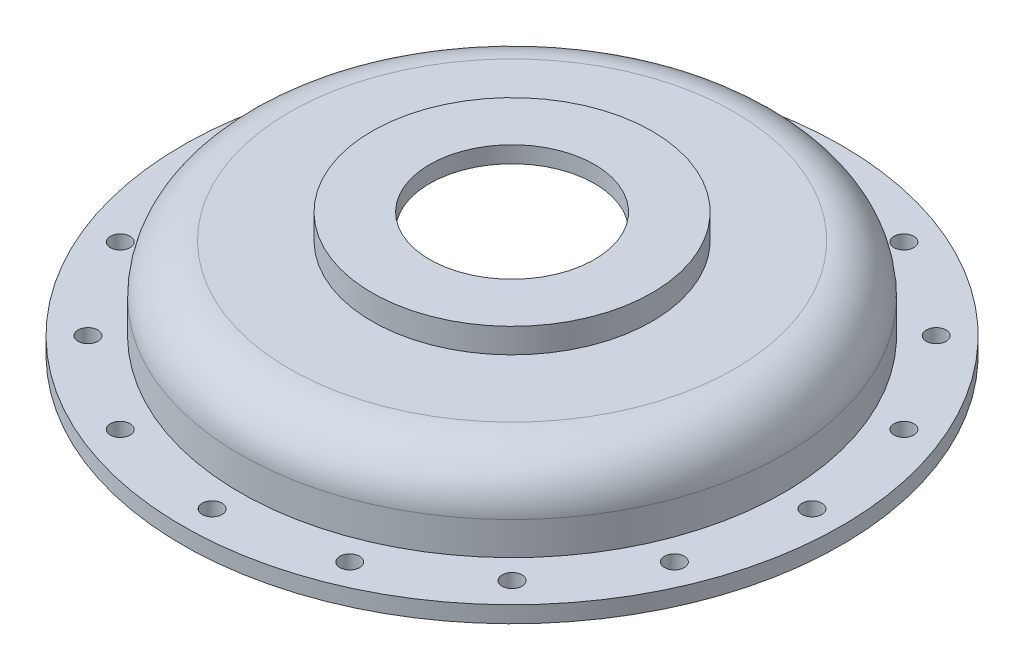
ISO-10303-21;
HEADER;
FILE_DESCRIPTION(('STEP AP214'),'2;1');
FILE_NAME('part.step','',(''),(''),'','','');
FILE_SCHEMA(('AUTOMOTIVE_DESIGN { 1 0 10303 214 1 1 1 1 }'));
ENDSEC;
DATA;
#1=APPLICATION_CONTEXT('core data for automotive mechanical design processes');
#2=APPLICATION_PROTOCOL_DEFINITION('international standard','automotive_design',2000,#1);
#3=PRODUCT_CONTEXT('',#1,'mechanical');
#4=PRODUCT('Part','Part','',(#3));
#5=PRODUCT_RELATED_PRODUCT_CATEGORY('part','',(#4));
#6=PRODUCT_DEFINITION_FORMATION('','',#4);
#7=PRODUCT_DEFINITION_CONTEXT('part definition',#1,'design');
#8=PRODUCT_DEFINITION('design','',#6,#7);
#9=PRODUCT_DEFINITION_SHAPE('','',#8);
#10=(LENGTH_UNIT() NAMED_UNIT(*) SI_UNIT(.MILLI.,.METRE.));
#11=(NAMED_UNIT(*) PLANE_ANGLE_UNIT() SI_UNIT($,.RADIAN.));
#12=(NAMED_UNIT(*) SI_UNIT($,.STERADIAN.) SOLID_ANGLE_UNIT());
#13=UNCERTAINTY_MEASURE_WITH_UNIT(LENGTH_MEASURE(1.E-05),#10,'distance_accuracy_value','');
#14=(GEOMETRIC_REPRESENTATION_CONTEXT(3) GLOBAL_UNCERTAINTY_ASSIGNED_CONTEXT((#13)) GLOBAL_UNIT_ASSIGNED_CONTEXT((#10,
#11,#12)) REPRESENTATION_CONTEXT('',''));
#15=CARTESIAN_POINT('',(0.,0.,0.));
#16=DIRECTION('',(0.,0.,1.));
#17=DIRECTION('',(1.,0.,0.));
#18=AXIS2_PLACEMENT_3D('',#15,#16,#17);
#19=CARTESIAN_POINT('',(0.,0.,0.));
#20=DIRECTION('',(0.,-1.,0.));
#21=DIRECTION('',(0.,0.,-1.));
#22=AXIS2_PLACEMENT_3D('',#19,#20,#21);
#23=CYLINDRICAL_SURFACE('',#22,200.);
#24=CARTESIAN_POINT('',(0.,0.,0.));
#25=DIRECTION('',(0.,-1.,0.));
#26=DIRECTION('',(0.,0.,-1.));
#27=AXIS2_PLACEMENT_3D('',#24,#25,#26);
#28=CIRCLE('',#27,200.);
#29=CARTESIAN_POINT('',(0.,0.,-200.));
#30=VERTEX_POINT('',#29);
#31=EDGE_CURVE('E100',#30,#30,#28,.T.);
#32=ORIENTED_EDGE('',*,*,#31,.F.);
#33=EDGE_LOOP('',(#32));
#34=FACE_BOUND('',#33,.T.);
#35=CARTESIAN_POINT('',(0.,10.,0.));
#36=DIRECTION('',(0.,-1.,0.));
#37=DIRECTION('',(0.,0.,-1.));
#38=AXIS2_PLACEMENT_3D('',#35,#36,#37);
#39=CIRCLE('',#38,200.);
#40=CARTESIAN_POINT('',(0.,10.,-200.));
#41=VERTEX_POINT('',#40);
#42=EDGE_CURVE('E10',#41,#41,#39,.T.);
#43=ORIENTED_EDGE('',*,*,#42,.T.);
#44=EDGE_LOOP('',(#43));
#45=FACE_BOUND('',#44,.T.);
#46=ADVANCED_FACE('F41',(#34,#45),#23,.T.);
#47=CARTESIAN_POINT('',(-200.,10.,0.));
#48=DIRECTION('',(0.,-1.,0.));
#49=DIRECTION('',(0.,0.,-1.));
#50=AXIS2_PLACEMENT_3D('',#47,#48,#49);
#51=PLANE('',#50);
#52=CARTESIAN_POINT('',(128.693434175952,10.,-128.693434175951));
#53=DIRECTION('',(0.,1.,0.));
#54=DIRECTION('',(-0.707106781186549,0.,0.707106781186546));
#55=AXIS2_PLACEMENT_3D('',#52,#53,#54);
#56=CIRCLE('',#55,6.);
#57=CARTESIAN_POINT('',(124.450793488833,10.,-124.450793488832));
#58=VERTEX_POINT('',#57);
#59=EDGE_CURVE('E178',#58,#58,#56,.T.);
#60=ORIENTED_EDGE('',*,*,#59,.F.);
#61=EDGE_LOOP('',(#60));
#62=FACE_BOUND('',#61,.T.);
#63=CARTESIAN_POINT('',(168.146074917054,10.,-69.6483846904459));
#64=DIRECTION('',(0.,1.,0.));
#65=DIRECTION('',(-0.923879532511288,0.,0.382683432365087));
#66=AXIS2_PLACEMENT_3D('',#63,#64,#65);
#67=CIRCLE('',#66,6.);
#68=CARTESIAN_POINT('',(162.602797721987,10.,-67.3522840962554));
#69=VERTEX_POINT('',#68);
#70=EDGE_CURVE('E170',#69,#69,#67,.T.);
#71=ORIENTED_EDGE('',*,*,#70,.F.);
#72=EDGE_LOOP('',(#71));
#73=FACE_BOUND('',#72,.T.);
#74=CARTESIAN_POINT('',(182.,10.,6.3544960366945E-13));
#75=DIRECTION('',(0.,1.,0.));
#76=DIRECTION('',(-1.,0.,0.));
#77=AXIS2_PLACEMENT_3D('',#74,#75,#76);
#78=CIRCLE('',#77,6.);
#79=CARTESIAN_POINT('',(176.,10.,6.14500715636391E-13));
#80=VERTEX_POINT('',#79);
#81=EDGE_CURVE('E162',#80,#80,#78,.T.);
#82=ORIENTED_EDGE('',*,*,#81,.F.);
#83=EDGE_LOOP('',(#82));
#84=FACE_BOUND('',#83,.T.);
#85=CARTESIAN_POINT('',(168.146074917054,10.,69.6483846904471));
#86=DIRECTION('',(0.,1.,0.));
#87=DIRECTION('',(-0.923879532511285,0.,-0.382683432365094));
#88=AXIS2_PLACEMENT_3D('',#85,#86,#87);
#89=CIRCLE('',#88,6.);
#90=CARTESIAN_POINT('',(162.602797721986,10.,67.3522840962565));
#91=VERTEX_POINT('',#90);
#92=EDGE_CURVE('E154',#91,#91,#89,.T.);
#93=ORIENTED_EDGE('',*,*,#92,.F.);
#94=EDGE_LOOP('',(#93));
#95=FACE_BOUND('',#94,.T.);
#96=CARTESIAN_POINT('',(128.693434175951,10.,128.693434175952));
#97=DIRECTION('',(0.,1.,0.));
#98=DIRECTION('',(-0.707106781186544,0.,-0.707106781186551));
#99=AXIS2_PLACEMENT_3D('',#96,#97,#98);
#100=CIRCLE('',#99,6.);
#101=CARTESIAN_POINT('',(124.450793488832,10.,124.450793488833));
#102=VERTEX_POINT('',#101);
#103=EDGE_CURVE('E146',#102,#102,#100,.T.);
#104=ORIENTED_EDGE('',*,*,#103,.F.);
#105=EDGE_LOOP('',(#104));
#106=FACE_BOUND('',#105,.T.);
#107=CARTESIAN_POINT('',(69.6483846904453,10.,168.146074917055));
#108=DIRECTION('',(0.,1.,0.));
#109=DIRECTION('',(-0.382683432365084,0.,-0.923879532511289));
#110=AXIS2_PLACEMENT_3D('',#107,#108,#109);
#111=CIRCLE('',#110,6.);
#112=CARTESIAN_POINT('',(67.3522840962548,10.,162.602797721987));
#113=VERTEX_POINT('',#112);
#114=EDGE_CURVE('E138',#113,#113,#111,.T.);
#115=ORIENTED_EDGE('',*,*,#114,.F.);
#116=EDGE_LOOP('',(#115));
#117=FACE_BOUND('',#116,.T.);
#118=CARTESIAN_POINT('',(0.,10.,182.));
#119=DIRECTION('',(0.,1.,0.));
#120=DIRECTION('',(0.,0.,-1.));
#121=AXIS2_PLACEMENT_3D('',#118,#119,#120);
#122=CIRCLE('',#121,6.);
#123=CARTESIAN_POINT('',(0.,10.,176.));
#124=VERTEX_POINT('',#123);
#125=EDGE_CURVE('E130',#124,#124,#122,.T.);
#126=ORIENTED_EDGE('',*,*,#125,.F.);
#127=EDGE_LOOP('',(#126));
#128=FACE_BOUND('',#127,.T.);
#129=CARTESIAN_POINT('',(-69.6483846904477,10.,168.146074917054));
#130=DIRECTION('',(0.,1.,0.));
#131=DIRECTION('',(0.382683432365097,0.,-0.923879532511284));
#132=AXIS2_PLACEMENT_3D('',#129,#130,#131);
#133=CIRCLE('',#132,6.);
#134=CARTESIAN_POINT('',(-67.3522840962571,10.,162.602797721986));
#135=VERTEX_POINT('',#134);
#136=EDGE_CURVE('E121',#135,#135,#133,.T.);
#137=ORIENTED_EDGE('',*,*,#136,.F.);
#138=EDGE_LOOP('',(#137));
#139=FACE_BOUND('',#138,.T.);
#140=CARTESIAN_POINT('',(-128.693434175953,10.,128.693434175951));
#141=DIRECTION('',(0.,1.,0.));
#142=DIRECTION('',(0.707106781186554,0.,-0.707106781186541));
#143=AXIS2_PLACEMENT_3D('',#140,#141,#142);
#144=CIRCLE('',#143,6.);
#145=CARTESIAN_POINT('',(-124.450793488833,10.,124.450793488831));
#146=VERTEX_POINT('',#145);
#147=EDGE_CURVE('E225',#146,#146,#144,.T.);
#148=ORIENTED_EDGE('',*,*,#147,.F.);
#149=EDGE_LOOP('',(#148));
#150=FACE_BOUND('',#149,.T.);
#151=CARTESIAN_POINT('',(-168.146074917055,10.,69.6483846904447));
#152=DIRECTION('',(0.,1.,0.));
#153=DIRECTION('',(0.923879532511291,0.,-0.382683432365081));
#154=AXIS2_PLACEMENT_3D('',#151,#152,#153);
#155=CIRCLE('',#154,6.);
#156=CARTESIAN_POINT('',(-162.602797721987,10.,67.3522840962542));
#157=VERTEX_POINT('',#156);
#158=EDGE_CURVE('E217',#157,#157,#155,.T.);
#159=ORIENTED_EDGE('',*,*,#158,.F.);
#160=EDGE_LOOP('',(#159));
#161=FACE_BOUND('',#160,.T.);
#162=CARTESIAN_POINT('',(-182.,10.,-1.90634881100835E-12));
#163=DIRECTION('',(0.,1.,0.));
#164=DIRECTION('',(1.,0.,0.));
#165=AXIS2_PLACEMENT_3D('',#162,#163,#164);
#166=CIRCLE('',#165,6.);
#167=CARTESIAN_POINT('',(-176.,10.,-1.84350214690917E-12));
#168=VERTEX_POINT('',#167);
#169=EDGE_CURVE('E209',#168,#168,#166,.T.);
#170=ORIENTED_EDGE('',*,*,#169,.F.);
#171=EDGE_LOOP('',(#170));
#172=FACE_BOUND('',#171,.T.);
#173=CARTESIAN_POINT('',(-168.146074917053,10.,-69.6483846904482));
#174=DIRECTION('',(0.,1.,0.));
#175=DIRECTION('',(0.923879532511283,0.,0.3826834323651));
#176=AXIS2_PLACEMENT_3D('',#173,#174,#175);
#177=CIRCLE('',#176,6.);
#178=CARTESIAN_POINT('',(-162.602797721986,10.,-67.3522840962576));
#179=VERTEX_POINT('',#178);
#180=EDGE_CURVE('E201',#179,#179,#177,.T.);
#181=ORIENTED_EDGE('',*,*,#180,.F.);
#182=EDGE_LOOP('',(#181));
#183=FACE_BOUND('',#182,.T.);
#184=CARTESIAN_POINT('',(-128.69343417595,10.,-128.693434175953));
#185=DIRECTION('',(0.,1.,0.));
#186=DIRECTION('',(0.707106781186539,0.,0.707106781186556));
#187=AXIS2_PLACEMENT_3D('',#184,#185,#186);
#188=CIRCLE('',#187,6.);
#189=CARTESIAN_POINT('',(-124.450793488831,10.,-124.450793488834));
#190=VERTEX_POINT('',#189);
#191=EDGE_CURVE('E193',#190,#190,#188,.T.);
#192=ORIENTED_EDGE('',*,*,#191,.F.);
#193=EDGE_LOOP('',(#192));
#194=FACE_BOUND('',#193,.T.);
#195=CARTESIAN_POINT('',(-69.6483846904441,10.,-168.146074917055));
#196=DIRECTION('',(0.,1.,0.));
#197=DIRECTION('',(0.382683432365077,0.,0.923879532511292));
#198=AXIS2_PLACEMENT_3D('',#195,#196,#197);
#199=CIRCLE('',#198,6.);
#200=CARTESIAN_POINT('',(-67.3522840962536,10.,-162.602797721987));
#201=VERTEX_POINT('',#200);
#202=EDGE_CURVE('E185',#201,#201,#199,.T.);
#203=ORIENTED_EDGE('',*,*,#202,.F.);
#204=EDGE_LOOP('',(#203));
#205=FACE_BOUND('',#204,.T.);
#206=CARTESIAN_POINT('',(69.6483846904465,10.,-168.146074917054));
#207=DIRECTION('',(0.,1.,0.));
#208=DIRECTION('',(-0.382683432365091,0.,0.923879532511287));
#209=AXIS2_PLACEMENT_3D('',#206,#207,#208);
#210=CIRCLE('',#209,6.);
#211=CARTESIAN_POINT('',(67.352284096256,10.,-162.602797721986));
#212=VERTEX_POINT('',#211);
#213=EDGE_CURVE('E113',#212,#212,#210,.T.);
#214=ORIENTED_EDGE('',*,*,#213,.F.);
#215=EDGE_LOOP('',(#214));
#216=FACE_BOUND('',#215,.T.);
#217=CARTESIAN_POINT('',(0.,10.,-182.));
#218=DIRECTION('',(0.,1.,0.));
#219=DIRECTION('',(0.,0.,1.));
#220=AXIS2_PLACEMENT_3D('',#217,#218,#219);
#221=CIRCLE('',#220,6.);
#222=CARTESIAN_POINT('',(0.,10.,-176.));
#223=VERTEX_POINT('',#222);
#224=EDGE_CURVE('E105',#223,#223,#221,.T.);
#225=ORIENTED_EDGE('',*,*,#224,.F.);
#226=EDGE_LOOP('',(#225));
#227=FACE_BOUND('',#226,.T.);
#228=ORIENTED_EDGE('',*,*,#42,.F.);
#229=EDGE_LOOP('',(#228));
#230=FACE_BOUND('',#229,.T.);
#231=CARTESIAN_POINT('',(0.,10.,0.));
#232=DIRECTION('',(0.,-1.,0.));
#233=DIRECTION('',(0.,0.,-1.));
#234=AXIS2_PLACEMENT_3D('',#231,#232,#233);
#235=CIRCLE('',#234,165.);
#236=CARTESIAN_POINT('',(0.,10.,-165.));
#237=VERTEX_POINT('',#236);
#238=EDGE_CURVE('E48',#237,#237,#235,.T.);
#239=ORIENTED_EDGE('',*,*,#238,.T.);
#240=EDGE_LOOP('',(#239));
#241=FACE_BOUND('',#240,.T.);
#242=ADVANCED_FACE('F244',(#62,#73,#84,#95,#106,#117,#128,#139,#150,#161,#172,#183,#194,#205,
#216,#227,#230,#241),#51,.F.);
#243=CARTESIAN_POINT('',(0.,0.,0.));
#244=DIRECTION('',(0.,-1.,0.));
#245=DIRECTION('',(0.,0.,-1.));
#246=AXIS2_PLACEMENT_3D('',#243,#244,#245);
#247=CYLINDRICAL_SURFACE('',#246,165.);
#248=ORIENTED_EDGE('',*,*,#238,.F.);
#249=EDGE_LOOP('',(#248));
#250=FACE_BOUND('',#249,.T.);
#251=CARTESIAN_POINT('',(0.,30.,0.));
#252=DIRECTION('',(0.,-1.,0.));
#253=DIRECTION('',(0.,0.,-1.));
#254=AXIS2_PLACEMENT_3D('',#251,#252,#253);
#255=CIRCLE('',#254,165.);
#256=CARTESIAN_POINT('',(0.,30.,-165.));
#257=VERTEX_POINT('',#256);
#258=EDGE_CURVE('E53',#257,#257,#255,.T.);
#259=ORIENTED_EDGE('',*,*,#258,.T.);
#260=EDGE_LOOP('',(#259));
#261=FACE_BOUND('',#260,.T.);
#262=ADVANCED_FACE('F247',(#250,#261),#247,.T.);
#263=CARTESIAN_POINT('',(0.,30.,0.));
#264=DIRECTION('',(0.,-1.,0.));
#265=DIRECTION('',(0.,0.,-1.));
#266=AXIS2_PLACEMENT_3D('',#263,#264,#265);
#267=TOROIDAL_SURFACE('',#266,135.,30.);
#268=ORIENTED_EDGE('',*,*,#258,.F.);
#269=EDGE_LOOP('',(#268));
#270=FACE_BOUND('',#269,.T.);
#271=CARTESIAN_POINT('',(0.,60.,0.));
#272=DIRECTION('',(0.,-1.,0.));
#273=DIRECTION('',(0.,0.,-1.));
#274=AXIS2_PLACEMENT_3D('',#271,#272,#273);
#275=CIRCLE('',#274,135.);
#276=CARTESIAN_POINT('',(0.,60.,-135.));
#277=VERTEX_POINT('',#276);
#278=EDGE_CURVE('E58',#277,#277,#275,.T.);
#279=ORIENTED_EDGE('',*,*,#278,.T.);
#280=EDGE_LOOP('',(#279));
#281=FACE_BOUND('',#280,.T.);
#282=ADVANCED_FACE('F297',(#270,#281),#267,.T.);
#283=CARTESIAN_POINT('',(-135.,60.,0.));
#284=DIRECTION('',(0.,-1.,0.));
#285=DIRECTION('',(0.,0.,-1.));
#286=AXIS2_PLACEMENT_3D('',#283,#284,#285);
#287=PLANE('',#286);
#288=ORIENTED_EDGE('',*,*,#278,.F.);
#289=EDGE_LOOP('',(#288));
#290=FACE_BOUND('',#289,.T.);
#291=CARTESIAN_POINT('',(0.,60.,0.));
#292=DIRECTION('',(0.,-1.,0.));
#293=DIRECTION('',(0.,0.,-1.));
#294=AXIS2_PLACEMENT_3D('',#291,#292,#293);
#295=CIRCLE('',#294,85.);
#296=CARTESIAN_POINT('',(0.,60.,-85.));
#297=VERTEX_POINT('',#296);
#298=EDGE_CURVE('E64',#297,#297,#295,.T.);
#299=ORIENTED_EDGE('',*,*,#298,.T.);
#300=EDGE_LOOP('',(#299));
#301=FACE_BOUND('',#300,.T.);
#302=ADVANCED_FACE('F305',(#290,#301),#287,.F.);
#303=CARTESIAN_POINT('',(0.,0.,0.));
#304=DIRECTION('',(0.,-1.,0.));
#305=DIRECTION('',(0.,0.,-1.));
#306=AXIS2_PLACEMENT_3D('',#303,#304,#305);
#307=CYLINDRICAL_SURFACE('',#306,85.);
#308=ORIENTED_EDGE('',*,*,#298,.F.);
#309=EDGE_LOOP('',(#308));
#310=FACE_BOUND('',#309,.T.);
#311=CARTESIAN_POINT('',(0.,75.,0.));
#312=DIRECTION('',(0.,-1.,0.));
#313=DIRECTION('',(0.,0.,-1.));
#314=AXIS2_PLACEMENT_3D('',#311,#312,#313);
#315=CIRCLE('',#314,85.);
#316=CARTESIAN_POINT('',(0.,75.,-85.));
#317=VERTEX_POINT('',#316);
#318=EDGE_CURVE('E68',#317,#317,#315,.T.);
#319=ORIENTED_EDGE('',*,*,#318,.T.);
#320=EDGE_LOOP('',(#319));
#321=FACE_BOUND('',#320,.T.);
#322=ADVANCED_FACE('F313',(#310,#321),#307,.T.);
#323=CARTESIAN_POINT('',(-85.,75.,0.));
#324=DIRECTION('',(0.,-1.,0.));
#325=DIRECTION('',(0.,0.,-1.));
#326=AXIS2_PLACEMENT_3D('',#323,#324,#325);
#327=PLANE('',#326);
#328=ORIENTED_EDGE('',*,*,#318,.F.);
#329=EDGE_LOOP('',(#328));
#330=FACE_BOUND('',#329,.T.);
#331=CARTESIAN_POINT('',(0.,75.,0.));
#332=DIRECTION('',(0.,-1.,0.));
#333=DIRECTION('',(0.,0.,-1.));
#334=AXIS2_PLACEMENT_3D('',#331,#332,#333);
#335=CIRCLE('',#334,50.);
#336=CARTESIAN_POINT('',(0.,75.,-50.));
#337=VERTEX_POINT('',#336);
#338=EDGE_CURVE('E72',#337,#337,#335,.T.);
#339=ORIENTED_EDGE('',*,*,#338,.T.);
#340=EDGE_LOOP('',(#339));
#341=FACE_BOUND('',#340,.T.);
#342=ADVANCED_FACE('F321',(#330,#341),#327,.F.);
#343=CARTESIAN_POINT('',(0.,0.,0.));
#344=DIRECTION('',(0.,-1.,0.));
#345=DIRECTION('',(0.,0.,-1.));
#346=AXIS2_PLACEMENT_3D('',#343,#344,#345);
#347=CYLINDRICAL_SURFACE('',#346,50.);
#348=ORIENTED_EDGE('',*,*,#338,.F.);
#349=EDGE_LOOP('',(#348));
#350=FACE_BOUND('',#349,.T.);
#351=CARTESIAN_POINT('',(0.,65.,0.));
#352=DIRECTION('',(0.,-1.,0.));
#353=DIRECTION('',(0.,0.,-1.));
#354=AXIS2_PLACEMENT_3D('',#351,#352,#353);
#355=CIRCLE('',#354,50.);
#356=CARTESIAN_POINT('',(0.,65.,-50.));
#357=VERTEX_POINT('',#356);
#358=EDGE_CURVE('E76',#357,#357,#355,.T.);
#359=ORIENTED_EDGE('',*,*,#358,.T.);
#360=EDGE_LOOP('',(#359));
#361=FACE_BOUND('',#360,.T.);
#362=ADVANCED_FACE('F329',(#350,#361),#347,.F.);
#363=CARTESIAN_POINT('',(-75.,65.,0.));
#364=DIRECTION('',(0.,1.,0.));
#365=DIRECTION('',(0.,0.,1.));
#366=AXIS2_PLACEMENT_3D('',#363,#364,#365);
#367=PLANE('',#366);
#368=ORIENTED_EDGE('',*,*,#358,.F.);
#369=EDGE_LOOP('',(#368));
#370=FACE_BOUND('',#369,.T.);
#371=CARTESIAN_POINT('',(0.,65.,0.));
#372=DIRECTION('',(0.,-1.,0.));
#373=DIRECTION('',(0.,0.,-1.));
#374=AXIS2_PLACEMENT_3D('',#371,#372,#373);
#375=CIRCLE('',#374,75.);
#376=CARTESIAN_POINT('',(0.,65.,-75.));
#377=VERTEX_POINT('',#376);
#378=EDGE_CURVE('E80',#377,#377,#375,.T.);
#379=ORIENTED_EDGE('',*,*,#378,.T.);
#380=EDGE_LOOP('',(#379));
#381=FACE_BOUND('',#380,.T.);
#382=ADVANCED_FACE('F337',(#370,#381),#367,.F.);
#383=CARTESIAN_POINT('',(0.,0.,0.));
#384=DIRECTION('',(0.,-1.,0.));
#385=DIRECTION('',(0.,0.,-1.));
#386=AXIS2_PLACEMENT_3D('',#383,#384,#385);
#387=CYLINDRICAL_SURFACE('',#386,75.);
#388=ORIENTED_EDGE('',*,*,#378,.F.);
#389=EDGE_LOOP('',(#388));
#390=FACE_BOUND('',#389,.T.);
#391=CARTESIAN_POINT('',(0.,50.,0.));
#392=DIRECTION('',(0.,-1.,0.));
#393=DIRECTION('',(0.,0.,-1.));
#394=AXIS2_PLACEMENT_3D('',#391,#392,#393);
#395=CIRCLE('',#394,75.);
#396=CARTESIAN_POINT('',(0.,50.,-75.));
#397=VERTEX_POINT('',#396);
#398=EDGE_CURVE('E84',#397,#397,#395,.T.);
#399=ORIENTED_EDGE('',*,*,#398,.T.);
#400=EDGE_LOOP('',(#399));
#401=FACE_BOUND('',#400,.T.);
#402=ADVANCED_FACE('F345',(#390,#401),#387,.F.);
#403=CARTESIAN_POINT('',(-135.,50.,0.));
#404=DIRECTION('',(0.,1.,0.));
#405=DIRECTION('',(0.,0.,1.));
#406=AXIS2_PLACEMENT_3D('',#403,#404,#405);
#407=PLANE('',#406);
#408=ORIENTED_EDGE('',*,*,#398,.F.);
#409=EDGE_LOOP('',(#408));
#410=FACE_BOUND('',#409,.T.);
#411=CARTESIAN_POINT('',(0.,50.,0.));
#412=DIRECTION('',(0.,-1.,0.));
#413=DIRECTION('',(0.,0.,-1.));
#414=AXIS2_PLACEMENT_3D('',#411,#412,#413);
#415=CIRCLE('',#414,135.);
#416=CARTESIAN_POINT('',(0.,50.,-135.));
#417=VERTEX_POINT('',#416);
#418=EDGE_CURVE('E88',#417,#417,#415,.T.);
#419=ORIENTED_EDGE('',*,*,#418,.T.);
#420=EDGE_LOOP('',(#419));
#421=FACE_BOUND('',#420,.T.);
#422=ADVANCED_FACE('F353',(#410,#421),#407,.F.);
#423=CARTESIAN_POINT('',(0.,30.,0.));
#424=DIRECTION('',(0.,-1.,0.));
#425=DIRECTION('',(0.,0.,-1.));
#426=AXIS2_PLACEMENT_3D('',#423,#424,#425);
#427=TOROIDAL_SURFACE('',#426,135.,20.);
#428=ORIENTED_EDGE('',*,*,#418,.F.);
#429=EDGE_LOOP('',(#428));
#430=FACE_BOUND('',#429,.T.);
#431=CARTESIAN_POINT('',(0.,30.,0.));
#432=DIRECTION('',(0.,-1.,0.));
#433=DIRECTION('',(0.,0.,-1.));
#434=AXIS2_PLACEMENT_3D('',#431,#432,#433);
#435=CIRCLE('',#434,155.);
#436=CARTESIAN_POINT('',(0.,30.,-155.));
#437=VERTEX_POINT('',#436);
#438=EDGE_CURVE('E92',#437,#437,#435,.T.);
#439=ORIENTED_EDGE('',*,*,#438,.T.);
#440=EDGE_LOOP('',(#439));
#441=FACE_BOUND('',#440,.T.);
#442=ADVANCED_FACE('F361',(#430,#441),#427,.F.);
#443=CARTESIAN_POINT('',(0.,0.,0.));
#444=DIRECTION('',(0.,-1.,0.));
#445=DIRECTION('',(0.,0.,-1.));
#446=AXIS2_PLACEMENT_3D('',#443,#444,#445);
#447=CYLINDRICAL_SURFACE('',#446,155.);
#448=ORIENTED_EDGE('',*,*,#438,.F.);
#449=EDGE_LOOP('',(#448));
#450=FACE_BOUND('',#449,.T.);
#451=CARTESIAN_POINT('',(0.,0.,0.));
#452=DIRECTION('',(0.,-1.,0.));
#453=DIRECTION('',(0.,0.,-1.));
#454=AXIS2_PLACEMENT_3D('',#451,#452,#453);
#455=CIRCLE('',#454,155.);
#456=CARTESIAN_POINT('',(0.,0.,-155.));
#457=VERTEX_POINT('',#456);
#458=EDGE_CURVE('E96',#457,#457,#455,.T.);
#459=ORIENTED_EDGE('',*,*,#458,.T.);
#460=EDGE_LOOP('',(#459));
#461=FACE_BOUND('',#460,.T.);
#462=ADVANCED_FACE('F276',(#450,#461),#447,.F.);
#463=CARTESIAN_POINT('',(-200.,0.,0.));
#464=DIRECTION('',(0.,1.,0.));
#465=DIRECTION('',(0.,0.,1.));
#466=AXIS2_PLACEMENT_3D('',#463,#464,#465);
#467=PLANE('',#466);
#468=CARTESIAN_POINT('',(128.693434175952,0.,-128.693434175951));
#469=DIRECTION('',(0.,1.,0.));
#470=DIRECTION('',(-0.707106781186549,0.,0.707106781186546));
#471=AXIS2_PLACEMENT_3D('',#468,#469,#470);
#472=CIRCLE('',#471,6.);
#473=CARTESIAN_POINT('',(124.450793488833,0.,-124.450793488832));
#474=VERTEX_POINT('',#473);
#475=EDGE_CURVE('E117',#474,#474,#472,.T.);
#476=ORIENTED_EDGE('',*,*,#475,.T.);
#477=EDGE_LOOP('',(#476));
#478=FACE_BOUND('',#477,.T.);
#479=CARTESIAN_POINT('',(168.146074917054,0.,-69.6483846904459));
#480=DIRECTION('',(0.,1.,0.));
#481=DIRECTION('',(-0.923879532511288,0.,0.382683432365087));
#482=AXIS2_PLACEMENT_3D('',#479,#480,#481);
#483=CIRCLE('',#482,6.);
#484=CARTESIAN_POINT('',(162.602797721987,0.,-67.3522840962554));
#485=VERTEX_POINT('',#484);
#486=EDGE_CURVE('E174',#485,#485,#483,.T.);
#487=ORIENTED_EDGE('',*,*,#486,.T.);
#488=EDGE_LOOP('',(#487));
#489=FACE_BOUND('',#488,.T.);
#490=CARTESIAN_POINT('',(182.,0.,6.3544960366945E-13));
#491=DIRECTION('',(0.,1.,0.));
#492=DIRECTION('',(-1.,0.,0.));
#493=AXIS2_PLACEMENT_3D('',#490,#491,#492);
#494=CIRCLE('',#493,6.);
#495=CARTESIAN_POINT('',(176.,0.,6.14500715636391E-13));
#496=VERTEX_POINT('',#495);
#497=EDGE_CURVE('E166',#496,#496,#494,.T.);
#498=ORIENTED_EDGE('',*,*,#497,.T.);
#499=EDGE_LOOP('',(#498));
#500=FACE_BOUND('',#499,.T.);
#501=CARTESIAN_POINT('',(168.146074917054,0.,69.6483846904471));
#502=DIRECTION('',(0.,1.,0.));
#503=DIRECTION('',(-0.923879532511285,0.,-0.382683432365094));
#504=AXIS2_PLACEMENT_3D('',#501,#502,#503);
#505=CIRCLE('',#504,6.);
#506=CARTESIAN_POINT('',(162.602797721986,0.,67.3522840962565));
#507=VERTEX_POINT('',#506);
#508=EDGE_CURVE('E158',#507,#507,#505,.T.);
#509=ORIENTED_EDGE('',*,*,#508,.T.);
#510=EDGE_LOOP('',(#509));
#511=FACE_BOUND('',#510,.T.);
#512=CARTESIAN_POINT('',(128.693434175951,0.,128.693434175952));
#513=DIRECTION('',(0.,1.,0.));
#514=DIRECTION('',(-0.707106781186544,0.,-0.707106781186551));
#515=AXIS2_PLACEMENT_3D('',#512,#513,#514);
#516=CIRCLE('',#515,6.);
#517=CARTESIAN_POINT('',(124.450793488832,0.,124.450793488833));
#518=VERTEX_POINT('',#517);
#519=EDGE_CURVE('E150',#518,#518,#516,.T.);
#520=ORIENTED_EDGE('',*,*,#519,.T.);
#521=EDGE_LOOP('',(#520));
#522=FACE_BOUND('',#521,.T.);
#523=CARTESIAN_POINT('',(69.6483846904453,0.,168.146074917055));
#524=DIRECTION('',(0.,1.,0.));
#525=DIRECTION('',(-0.382683432365084,0.,-0.923879532511289));
#526=AXIS2_PLACEMENT_3D('',#523,#524,#525);
#527=CIRCLE('',#526,6.);
#528=CARTESIAN_POINT('',(67.3522840962548,0.,162.602797721987));
#529=VERTEX_POINT('',#528);
#530=EDGE_CURVE('E142',#529,#529,#527,.T.);
#531=ORIENTED_EDGE('',*,*,#530,.T.);
#532=EDGE_LOOP('',(#531));
#533=FACE_BOUND('',#532,.T.);
#534=CARTESIAN_POINT('',(0.,0.,182.));
#535=DIRECTION('',(0.,1.,0.));
#536=DIRECTION('',(0.,0.,-1.));
#537=AXIS2_PLACEMENT_3D('',#534,#535,#536);
#538=CIRCLE('',#537,6.);
#539=CARTESIAN_POINT('',(0.,0.,176.));
#540=VERTEX_POINT('',#539);
#541=EDGE_CURVE('E134',#540,#540,#538,.T.);
#542=ORIENTED_EDGE('',*,*,#541,.T.);
#543=EDGE_LOOP('',(#542));
#544=FACE_BOUND('',#543,.T.);
#545=CARTESIAN_POINT('',(-69.6483846904477,0.,168.146074917054));
#546=DIRECTION('',(0.,1.,0.));
#547=DIRECTION('',(0.382683432365097,0.,-0.923879532511284));
#548=AXIS2_PLACEMENT_3D('',#545,#546,#547);
#549=CIRCLE('',#548,6.);
#550=CARTESIAN_POINT('',(-67.3522840962571,0.,162.602797721986));
#551=VERTEX_POINT('',#550);
#552=EDGE_CURVE('E125',#551,#551,#549,.T.);
#553=ORIENTED_EDGE('',*,*,#552,.T.);
#554=EDGE_LOOP('',(#553));
#555=FACE_BOUND('',#554,.T.);
#556=CARTESIAN_POINT('',(-128.693434175953,0.,128.693434175951));
#557=DIRECTION('',(0.,1.,0.));
#558=DIRECTION('',(0.707106781186554,0.,-0.707106781186541));
#559=AXIS2_PLACEMENT_3D('',#556,#557,#558);
#560=CIRCLE('',#559,6.);
#561=CARTESIAN_POINT('',(-124.450793488833,0.,124.450793488831));
#562=VERTEX_POINT('',#561);
#563=EDGE_CURVE('E126',#562,#562,#560,.T.);
#564=ORIENTED_EDGE('',*,*,#563,.T.);
#565=EDGE_LOOP('',(#564));
#566=FACE_BOUND('',#565,.T.);
#567=CARTESIAN_POINT('',(-168.146074917055,0.,69.6483846904447));
#568=DIRECTION('',(0.,1.,0.));
#569=DIRECTION('',(0.923879532511291,0.,-0.382683432365081));
#570=AXIS2_PLACEMENT_3D('',#567,#568,#569);
#571=CIRCLE('',#570,6.);
#572=CARTESIAN_POINT('',(-162.602797721987,0.,67.3522840962542));
#573=VERTEX_POINT('',#572);
#574=EDGE_CURVE('E221',#573,#573,#571,.T.);
#575=ORIENTED_EDGE('',*,*,#574,.T.);
#576=EDGE_LOOP('',(#575));
#577=FACE_BOUND('',#576,.T.);
#578=CARTESIAN_POINT('',(-182.,0.,-1.90634881100835E-12));
#579=DIRECTION('',(0.,1.,0.));
#580=DIRECTION('',(1.,0.,0.));
#581=AXIS2_PLACEMENT_3D('',#578,#579,#580);
#582=CIRCLE('',#581,6.);
#583=CARTESIAN_POINT('',(-176.,0.,-1.84350214690917E-12));
#584=VERTEX_POINT('',#583);
#585=EDGE_CURVE('E213',#584,#584,#582,.T.);
#586=ORIENTED_EDGE('',*,*,#585,.T.);
#587=EDGE_LOOP('',(#586));
#588=FACE_BOUND('',#587,.T.);
#589=CARTESIAN_POINT('',(-168.146074917053,0.,-69.6483846904482));
#590=DIRECTION('',(0.,1.,0.));
#591=DIRECTION('',(0.923879532511283,0.,0.3826834323651));
#592=AXIS2_PLACEMENT_3D('',#589,#590,#591);
#593=CIRCLE('',#592,6.);
#594=CARTESIAN_POINT('',(-162.602797721986,0.,-67.3522840962576));
#595=VERTEX_POINT('',#594);
#596=EDGE_CURVE('E205',#595,#595,#593,.T.);
#597=ORIENTED_EDGE('',*,*,#596,.T.);
#598=EDGE_LOOP('',(#597));
#599=FACE_BOUND('',#598,.T.);
#600=CARTESIAN_POINT('',(-128.69343417595,0.,-128.693434175953));
#601=DIRECTION('',(0.,1.,0.));
#602=DIRECTION('',(0.707106781186539,0.,0.707106781186556));
#603=AXIS2_PLACEMENT_3D('',#600,#601,#602);
#604=CIRCLE('',#603,6.);
#605=CARTESIAN_POINT('',(-124.450793488831,0.,-124.450793488834));
#606=VERTEX_POINT('',#605);
#607=EDGE_CURVE('E197',#606,#606,#604,.T.);
#608=ORIENTED_EDGE('',*,*,#607,.T.);
#609=EDGE_LOOP('',(#608));
#610=FACE_BOUND('',#609,.T.);
#611=CARTESIAN_POINT('',(-69.6483846904441,0.,-168.146074917055));
#612=DIRECTION('',(0.,1.,0.));
#613=DIRECTION('',(0.382683432365077,0.,0.923879532511292));
#614=AXIS2_PLACEMENT_3D('',#611,#612,#613);
#615=CIRCLE('',#614,6.);
#616=CARTESIAN_POINT('',(-67.3522840962536,0.,-162.602797721987));
#617=VERTEX_POINT('',#616);
#618=EDGE_CURVE('E189',#617,#617,#615,.T.);
#619=ORIENTED_EDGE('',*,*,#618,.T.);
#620=EDGE_LOOP('',(#619));
#621=FACE_BOUND('',#620,.T.);
#622=CARTESIAN_POINT('',(69.6483846904465,0.,-168.146074917054));
#623=DIRECTION('',(0.,1.,0.));
#624=DIRECTION('',(-0.382683432365091,0.,0.923879532511287));
#625=AXIS2_PLACEMENT_3D('',#622,#623,#624);
#626=CIRCLE('',#625,6.);
#627=CARTESIAN_POINT('',(67.352284096256,0.,-162.602797721986));
#628=VERTEX_POINT('',#627);
#629=EDGE_CURVE('E109',#628,#628,#626,.T.);
#630=ORIENTED_EDGE('',*,*,#629,.T.);
#631=EDGE_LOOP('',(#630));
#632=FACE_BOUND('',#631,.T.);
#633=CARTESIAN_POINT('',(0.,0.,-182.));
#634=DIRECTION('',(0.,1.,0.));
#635=DIRECTION('',(0.,0.,1.));
#636=AXIS2_PLACEMENT_3D('',#633,#634,#635);
#637=CIRCLE('',#636,6.);
#638=CARTESIAN_POINT('',(0.,0.,-176.));
#639=VERTEX_POINT('',#638);
#640=EDGE_CURVE('E104',#639,#639,#637,.T.);
#641=ORIENTED_EDGE('',*,*,#640,.T.);
#642=EDGE_LOOP('',(#641));
#643=FACE_BOUND('',#642,.T.);
#644=ORIENTED_EDGE('',*,*,#458,.F.);
#645=EDGE_LOOP('',(#644));
#646=FACE_BOUND('',#645,.T.);
#647=ORIENTED_EDGE('',*,*,#31,.T.);
#648=EDGE_LOOP('',(#647));
#649=FACE_BOUND('',#648,.T.);
#650=ADVANCED_FACE('F233',(#478,#489,#500,#511,#522,#533,#544,#555,#566,#577,#588,#599,#610,
#621,#632,#643,#646,#649),#467,.F.);
#651=CARTESIAN_POINT('',(0.,0.,-182.));
#652=DIRECTION('',(0.,1.,0.));
#653=DIRECTION('',(0.,0.,1.));
#654=AXIS2_PLACEMENT_3D('',#651,#652,#653);
#655=CYLINDRICAL_SURFACE('',#654,6.);
#656=ORIENTED_EDGE('',*,*,#640,.F.);
#657=EDGE_LOOP('',(#656));
#658=FACE_BOUND('',#657,.T.);
#659=ORIENTED_EDGE('',*,*,#224,.T.);
#660=EDGE_LOOP('',(#659));
#661=FACE_BOUND('',#660,.T.);
#662=ADVANCED_FACE('F264',(#658,#661),#655,.F.);
#663=CARTESIAN_POINT('',(69.6483846904465,0.,-168.146074917054));
#664=DIRECTION('',(0.,1.,0.));
#665=DIRECTION('',(0.,0.,1.));
#666=AXIS2_PLACEMENT_3D('',#663,#664,#665);
#667=CYLINDRICAL_SURFACE('',#666,6.);
#668=ORIENTED_EDGE('',*,*,#629,.F.);
#669=EDGE_LOOP('',(#668));
#670=FACE_BOUND('',#669,.T.);
#671=ORIENTED_EDGE('',*,*,#213,.T.);
#672=EDGE_LOOP('',(#671));
#673=FACE_BOUND('',#672,.T.);
#674=ADVANCED_FACE('F266',(#670,#673),#667,.F.);
#675=CARTESIAN_POINT('',(-69.6483846904441,0.,-168.146074917055));
#676=DIRECTION('',(0.,1.,0.));
#677=DIRECTION('',(0.,0.,1.));
#678=AXIS2_PLACEMENT_3D('',#675,#676,#677);
#679=CYLINDRICAL_SURFACE('',#678,6.);
#680=ORIENTED_EDGE('',*,*,#618,.F.);
#681=EDGE_LOOP('',(#680));
#682=FACE_BOUND('',#681,.T.);
#683=ORIENTED_EDGE('',*,*,#202,.T.);
#684=EDGE_LOOP('',(#683));
#685=FACE_BOUND('',#684,.T.);
#686=ADVANCED_FACE('F273',(#682,#685),#679,.F.);
#687=CARTESIAN_POINT('',(-128.69343417595,0.,-128.693434175953));
#688=DIRECTION('',(0.,1.,0.));
#689=DIRECTION('',(0.,0.,1.));
#690=AXIS2_PLACEMENT_3D('',#687,#688,#689);
#691=CYLINDRICAL_SURFACE('',#690,6.);
#692=ORIENTED_EDGE('',*,*,#607,.F.);
#693=EDGE_LOOP('',(#692));
#694=FACE_BOUND('',#693,.T.);
#695=ORIENTED_EDGE('',*,*,#191,.T.);
#696=EDGE_LOOP('',(#695));
#697=FACE_BOUND('',#696,.T.);
#698=ADVANCED_FACE('F398',(#694,#697),#691,.F.);
#699=CARTESIAN_POINT('',(-168.146074917053,0.,-69.6483846904482));
#700=DIRECTION('',(0.,1.,0.));
#701=DIRECTION('',(0.,0.,1.));
#702=AXIS2_PLACEMENT_3D('',#699,#700,#701);
#703=CYLINDRICAL_SURFACE('',#702,6.);
#704=ORIENTED_EDGE('',*,*,#596,.F.);
#705=EDGE_LOOP('',(#704));
#706=FACE_BOUND('',#705,.T.);
#707=ORIENTED_EDGE('',*,*,#180,.T.);
#708=EDGE_LOOP('',(#707));
#709=FACE_BOUND('',#708,.T.);
#710=ADVANCED_FACE('F409',(#706,#709),#703,.F.);
#711=CARTESIAN_POINT('',(-182.,0.,-1.90634881100835E-12));
#712=DIRECTION('',(0.,1.,0.));
#713=DIRECTION('',(0.,0.,1.));
#714=AXIS2_PLACEMENT_3D('',#711,#712,#713);
#715=CYLINDRICAL_SURFACE('',#714,6.);
#716=ORIENTED_EDGE('',*,*,#585,.F.);
#717=EDGE_LOOP('',(#716));
#718=FACE_BOUND('',#717,.T.);
#719=ORIENTED_EDGE('',*,*,#169,.T.);
#720=EDGE_LOOP('',(#719));
#721=FACE_BOUND('',#720,.T.);
#722=ADVANCED_FACE('F420',(#718,#721),#715,.F.);
#723=CARTESIAN_POINT('',(-168.146074917055,0.,69.6483846904447));
#724=DIRECTION('',(0.,1.,0.));
#725=DIRECTION('',(0.,0.,1.));
#726=AXIS2_PLACEMENT_3D('',#723,#724,#725);
#727=CYLINDRICAL_SURFACE('',#726,6.);
#728=ORIENTED_EDGE('',*,*,#574,.F.);
#729=EDGE_LOOP('',(#728));
#730=FACE_BOUND('',#729,.T.);
#731=ORIENTED_EDGE('',*,*,#158,.T.);
#732=EDGE_LOOP('',(#731));
#733=FACE_BOUND('',#732,.T.);
#734=ADVANCED_FACE('F240',(#730,#733),#727,.F.);
#735=CARTESIAN_POINT('',(-128.693434175953,0.,128.693434175951));
#736=DIRECTION('',(0.,1.,0.));
#737=DIRECTION('',(0.,0.,1.));
#738=AXIS2_PLACEMENT_3D('',#735,#736,#737);
#739=CYLINDRICAL_SURFACE('',#738,6.);
#740=ORIENTED_EDGE('',*,*,#563,.F.);
#741=EDGE_LOOP('',(#740));
#742=FACE_BOUND('',#741,.T.);
#743=ORIENTED_EDGE('',*,*,#147,.T.);
#744=EDGE_LOOP('',(#743));
#745=FACE_BOUND('',#744,.T.);
#746=ADVANCED_FACE('F236',(#742,#745),#739,.F.);
#747=CARTESIAN_POINT('',(-69.6483846904477,0.,168.146074917054));
#748=DIRECTION('',(0.,1.,0.));
#749=DIRECTION('',(0.,0.,1.));
#750=AXIS2_PLACEMENT_3D('',#747,#748,#749);
#751=CYLINDRICAL_SURFACE('',#750,6.);
#752=ORIENTED_EDGE('',*,*,#552,.F.);
#753=EDGE_LOOP('',(#752));
#754=FACE_BOUND('',#753,.T.);
#755=ORIENTED_EDGE('',*,*,#136,.T.);
#756=EDGE_LOOP('',(#755));
#757=FACE_BOUND('',#756,.T.);
#758=ADVANCED_FACE('F239',(#754,#757),#751,.F.);
#759=CARTESIAN_POINT('',(0.,0.,182.));
#760=DIRECTION('',(0.,1.,0.));
#761=DIRECTION('',(0.,0.,1.));
#762=AXIS2_PLACEMENT_3D('',#759,#760,#761);
#763=CYLINDRICAL_SURFACE('',#762,6.);
#764=ORIENTED_EDGE('',*,*,#541,.F.);
#765=EDGE_LOOP('',(#764));
#766=FACE_BOUND('',#765,.T.);
#767=ORIENTED_EDGE('',*,*,#125,.T.);
#768=EDGE_LOOP('',(#767));
#769=FACE_BOUND('',#768,.T.);
#770=ADVANCED_FACE('F458',(#766,#769),#763,.F.);
#771=CARTESIAN_POINT('',(69.6483846904453,0.,168.146074917055));
#772=DIRECTION('',(0.,1.,0.));
#773=DIRECTION('',(0.,0.,1.));
#774=AXIS2_PLACEMENT_3D('',#771,#772,#773);
#775=CYLINDRICAL_SURFACE('',#774,6.);
#776=ORIENTED_EDGE('',*,*,#530,.F.);
#777=EDGE_LOOP('',(#776));
#778=FACE_BOUND('',#777,.T.);
#779=ORIENTED_EDGE('',*,*,#114,.T.);
#780=EDGE_LOOP('',(#779));
#781=FACE_BOUND('',#780,.T.);
#782=ADVANCED_FACE('F469',(#778,#781),#775,.F.);
#783=CARTESIAN_POINT('',(128.693434175951,0.,128.693434175952));
#784=DIRECTION('',(0.,1.,0.));
#785=DIRECTION('',(0.,0.,1.));
#786=AXIS2_PLACEMENT_3D('',#783,#784,#785);
#787=CYLINDRICAL_SURFACE('',#786,6.);
#788=ORIENTED_EDGE('',*,*,#519,.F.);
#789=EDGE_LOOP('',(#788));
#790=FACE_BOUND('',#789,.T.);
#791=ORIENTED_EDGE('',*,*,#103,.T.);
#792=EDGE_LOOP('',(#791));
#793=FACE_BOUND('',#792,.T.);
#794=ADVANCED_FACE('F480',(#790,#793),#787,.F.);
#795=CARTESIAN_POINT('',(168.146074917054,0.,69.6483846904471));
#796=DIRECTION('',(0.,1.,0.));
#797=DIRECTION('',(0.,0.,1.));
#798=AXIS2_PLACEMENT_3D('',#795,#796,#797);
#799=CYLINDRICAL_SURFACE('',#798,6.);
#800=ORIENTED_EDGE('',*,*,#508,.F.);
#801=EDGE_LOOP('',(#800));
#802=FACE_BOUND('',#801,.T.);
#803=ORIENTED_EDGE('',*,*,#92,.T.);
#804=EDGE_LOOP('',(#803));
#805=FACE_BOUND('',#804,.T.);
#806=ADVANCED_FACE('F491',(#802,#805),#799,.F.);
#807=CARTESIAN_POINT('',(182.,0.,6.3544960366945E-13));
#808=DIRECTION('',(0.,1.,0.));
#809=DIRECTION('',(0.,0.,1.));
#810=AXIS2_PLACEMENT_3D('',#807,#808,#809);
#811=CYLINDRICAL_SURFACE('',#810,6.);
#812=ORIENTED_EDGE('',*,*,#497,.F.);
#813=EDGE_LOOP('',(#812));
#814=FACE_BOUND('',#813,.T.);
#815=ORIENTED_EDGE('',*,*,#81,.T.);
#816=EDGE_LOOP('',(#815));
#817=FACE_BOUND('',#816,.T.);
#818=ADVANCED_FACE('F502',(#814,#817),#811,.F.);
#819=CARTESIAN_POINT('',(168.146074917054,0.,-69.6483846904459));
#820=DIRECTION('',(0.,1.,0.));
#821=DIRECTION('',(0.,0.,1.));
#822=AXIS2_PLACEMENT_3D('',#819,#820,#821);
#823=CYLINDRICAL_SURFACE('',#822,6.);
#824=ORIENTED_EDGE('',*,*,#486,.F.);
#825=EDGE_LOOP('',(#824));
#826=FACE_BOUND('',#825,.T.);
#827=ORIENTED_EDGE('',*,*,#70,.T.);
#828=EDGE_LOOP('',(#827));
#829=FACE_BOUND('',#828,.T.);
#830=ADVANCED_FACE('F513',(#826,#829),#823,.F.);
#831=CARTESIAN_POINT('',(128.693434175952,0.,-128.693434175951));
#832=DIRECTION('',(0.,1.,0.));
#833=DIRECTION('',(0.,0.,1.));
#834=AXIS2_PLACEMENT_3D('',#831,#832,#833);
#835=CYLINDRICAL_SURFACE('',#834,6.);
#836=ORIENTED_EDGE('',*,*,#475,.F.);
#837=EDGE_LOOP('',(#836));
#838=FACE_BOUND('',#837,.T.);
#839=ORIENTED_EDGE('',*,*,#59,.T.);
#840=EDGE_LOOP('',(#839));
#841=FACE_BOUND('',#840,.T.);
#842=ADVANCED_FACE('F524',(#838,#841),#835,.F.);
#843=CLOSED_SHELL('',(#46,#242,#262,#282,#302,#322,#342,#362,#382,#402,#422,#442,#462,#650,#662,
#674,#686,#698,#710,#722,#734,#746,#758,#770,#782,#794,#806,#818,#830,#842));
#844=MANIFOLD_SOLID_BREP('B2',#843);
#845=ADVANCED_BREP_SHAPE_REPRESENTATION('',(#18,#844),#14);
#846=SHAPE_DEFINITION_REPRESENTATION(#9,#845);
ENDSEC;
END-ISO-10303-21;
